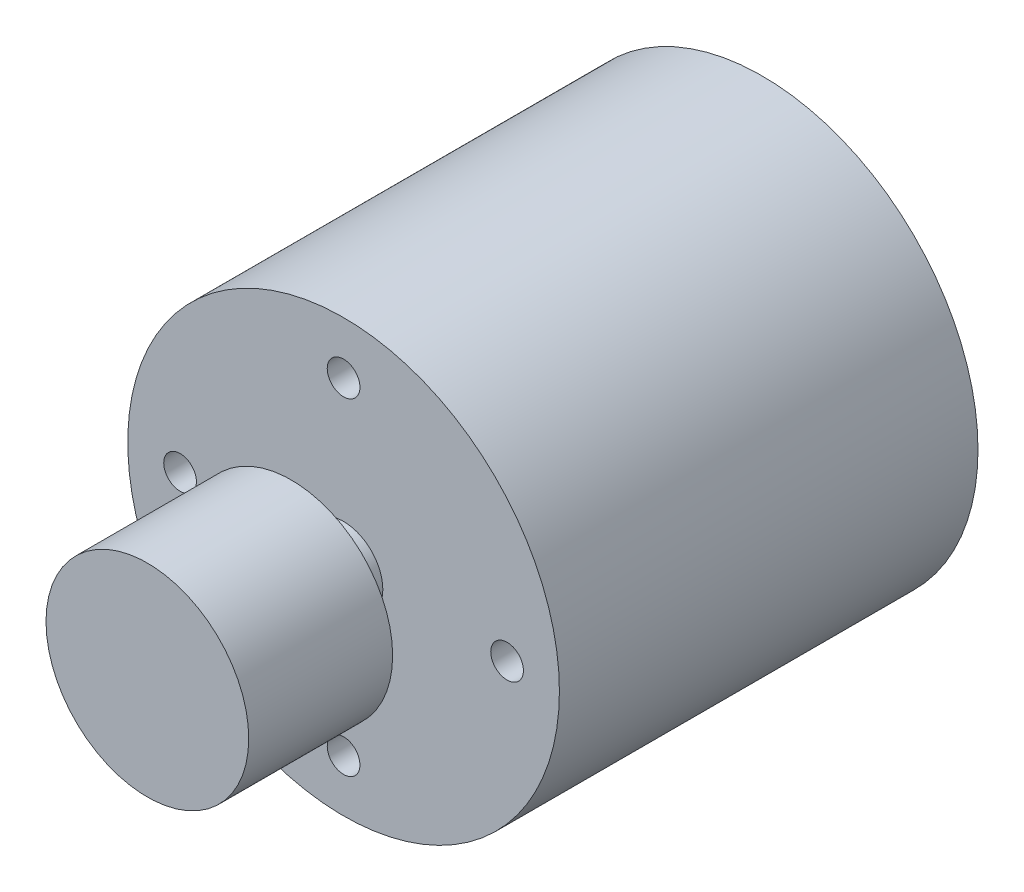
ISO-10303-21;
HEADER;
FILE_DESCRIPTION(('STEP AP214'),'2;1');
FILE_NAME('part.step','',(''),(''),'','','');
FILE_SCHEMA(('AUTOMOTIVE_DESIGN { 1 0 10303 214 1 1 1 1 }'));
ENDSEC;
DATA;
#1=APPLICATION_CONTEXT('core data for automotive mechanical design processes');
#2=APPLICATION_PROTOCOL_DEFINITION('international standard','automotive_design',2000,#1);
#3=PRODUCT_CONTEXT('',#1,'mechanical');
#4=PRODUCT('Part','Part','',(#3));
#5=PRODUCT_RELATED_PRODUCT_CATEGORY('part','',(#4));
#6=PRODUCT_DEFINITION_FORMATION('','',#4);
#7=PRODUCT_DEFINITION_CONTEXT('part definition',#1,'design');
#8=PRODUCT_DEFINITION('design','',#6,#7);
#9=PRODUCT_DEFINITION_SHAPE('','',#8);
#10=(LENGTH_UNIT() NAMED_UNIT(*) SI_UNIT(.MILLI.,.METRE.));
#11=(NAMED_UNIT(*) PLANE_ANGLE_UNIT() SI_UNIT($,.RADIAN.));
#12=(NAMED_UNIT(*) SI_UNIT($,.STERADIAN.) SOLID_ANGLE_UNIT());
#13=UNCERTAINTY_MEASURE_WITH_UNIT(LENGTH_MEASURE(1.E-05),#10,'distance_accuracy_value','');
#14=(GEOMETRIC_REPRESENTATION_CONTEXT(3) GLOBAL_UNCERTAINTY_ASSIGNED_CONTEXT((#13)) GLOBAL_UNIT_ASSIGNED_CONTEXT((#10,
#11,#12)) REPRESENTATION_CONTEXT('',''));
#15=CARTESIAN_POINT('',(0.,0.,0.));
#16=DIRECTION('',(0.,0.,1.));
#17=DIRECTION('',(1.,0.,0.));
#18=AXIS2_PLACEMENT_3D('',#15,#16,#17);
#19=CARTESIAN_POINT('',(0.,0.,15.));
#20=DIRECTION('',(0.,0.,-1.));
#21=DIRECTION('',(1.,0.,0.));
#22=AXIS2_PLACEMENT_3D('',#19,#20,#21);
#23=CYLINDRICAL_SURFACE('',#22,3.);
#24=CARTESIAN_POINT('',(0.,0.,0.));
#25=DIRECTION('',(0.,0.,1.));
#26=DIRECTION('',(1.,0.,0.));
#27=AXIS2_PLACEMENT_3D('',#24,#25,#26);
#28=CIRCLE('',#27,3.);
#29=CARTESIAN_POINT('',(3.,0.,0.));
#30=VERTEX_POINT('',#29);
#31=EDGE_CURVE('E45',#30,#30,#28,.F.);
#32=ORIENTED_EDGE('',*,*,#31,.F.);
#33=EDGE_LOOP('',(#32));
#34=FACE_BOUND('',#33,.T.);
#35=CARTESIAN_POINT('',(0.,0.,4.00000000000006));
#36=DIRECTION('',(0.,0.,-1.));
#37=DIRECTION('',(-1.,0.,0.));
#38=AXIS2_PLACEMENT_3D('',#35,#36,#37);
#39=CIRCLE('',#38,3.);
#40=CARTESIAN_POINT('',(-2.99999999999999,0.,4.00000000000006));
#41=VERTEX_POINT('',#40);
#42=EDGE_CURVE('E11',#41,#41,#39,.T.);
#43=ORIENTED_EDGE('',*,*,#42,.T.);
#44=EDGE_LOOP('',(#43));
#45=FACE_BOUND('',#44,.T.);
#46=ADVANCED_FACE('F37',(#34,#45),#23,.T.);
#47=CARTESIAN_POINT('',(0.,0.,0.));
#48=DIRECTION('',(0.,0.,-1.));
#49=DIRECTION('',(1.,0.,0.));
#50=AXIS2_PLACEMENT_3D('',#47,#48,#49);
#51=PLANE('',#50);
#52=CARTESIAN_POINT('',(0.,12.5,0.));
#53=DIRECTION('',(0.,0.,-1.));
#54=DIRECTION('',(-1.,0.,0.));
#55=AXIS2_PLACEMENT_3D('',#52,#53,#54);
#56=CIRCLE('',#55,1.24999999999999);
#57=CARTESIAN_POINT('',(-1.24999999999998,12.5,0.));
#58=VERTEX_POINT('',#57);
#59=EDGE_CURVE('E69',#58,#58,#56,.T.);
#60=ORIENTED_EDGE('',*,*,#59,.T.);
#61=EDGE_LOOP('',(#60));
#62=FACE_BOUND('',#61,.T.);
#63=CARTESIAN_POINT('',(-12.5,0.,0.));
#64=DIRECTION('',(0.,0.,-1.));
#65=DIRECTION('',(-1.,0.,0.));
#66=AXIS2_PLACEMENT_3D('',#63,#64,#65);
#67=CIRCLE('',#66,1.24999999999999);
#68=CARTESIAN_POINT('',(-13.75,0.,0.));
#69=VERTEX_POINT('',#68);
#70=EDGE_CURVE('E68',#69,#69,#67,.T.);
#71=ORIENTED_EDGE('',*,*,#70,.T.);
#72=EDGE_LOOP('',(#71));
#73=FACE_BOUND('',#72,.T.);
#74=CARTESIAN_POINT('',(0.,-12.5,0.));
#75=DIRECTION('',(0.,0.,-1.));
#76=DIRECTION('',(-1.,0.,0.));
#77=AXIS2_PLACEMENT_3D('',#74,#75,#76);
#78=CIRCLE('',#77,1.24999999999999);
#79=CARTESIAN_POINT('',(-1.24999999999998,-12.5,0.));
#80=VERTEX_POINT('',#79);
#81=EDGE_CURVE('E81',#80,#80,#78,.T.);
#82=ORIENTED_EDGE('',*,*,#81,.T.);
#83=EDGE_LOOP('',(#82));
#84=FACE_BOUND('',#83,.T.);
#85=CARTESIAN_POINT('',(12.5,0.,0.));
#86=DIRECTION('',(0.,0.,-1.));
#87=DIRECTION('',(-1.,0.,0.));
#88=AXIS2_PLACEMENT_3D('',#85,#86,#87);
#89=CIRCLE('',#88,1.24999999999999);
#90=CARTESIAN_POINT('',(11.25,0.,0.));
#91=VERTEX_POINT('',#90);
#92=EDGE_CURVE('E87',#91,#91,#89,.T.);
#93=ORIENTED_EDGE('',*,*,#92,.T.);
#94=EDGE_LOOP('',(#93));
#95=FACE_BOUND('',#94,.T.);
#96=CARTESIAN_POINT('',(0.,0.,0.));
#97=DIRECTION('',(0.,0.,1.));
#98=DIRECTION('',(1.,0.,0.));
#99=AXIS2_PLACEMENT_3D('',#96,#97,#98);
#100=CIRCLE('',#99,16.5);
#101=CARTESIAN_POINT('',(16.5,0.,0.));
#102=VERTEX_POINT('',#101);
#103=EDGE_CURVE('E93',#102,#102,#100,.T.);
#104=ORIENTED_EDGE('',*,*,#103,.T.);
#105=EDGE_LOOP('',(#104));
#106=FACE_BOUND('',#105,.T.);
#107=ORIENTED_EDGE('',*,*,#31,.T.);
#108=EDGE_LOOP('',(#107));
#109=FACE_BOUND('',#108,.T.);
#110=ADVANCED_FACE('F101',(#62,#73,#84,#95,#106,#109),#51,.F.);
#111=CARTESIAN_POINT('',(0.,0.,-32.));
#112=DIRECTION('',(0.,0.,1.));
#113=DIRECTION('',(-1.,0.,0.));
#114=AXIS2_PLACEMENT_3D('',#111,#112,#113);
#115=CYLINDRICAL_SURFACE('',#114,16.5);
#116=CARTESIAN_POINT('',(0.,0.,-32.));
#117=DIRECTION('',(0.,0.,1.));
#118=DIRECTION('',(1.,0.,0.));
#119=AXIS2_PLACEMENT_3D('',#116,#117,#118);
#120=CIRCLE('',#119,16.5);
#121=CARTESIAN_POINT('',(16.5,0.,-32.));
#122=VERTEX_POINT('',#121);
#123=EDGE_CURVE('E94',#122,#122,#120,.T.);
#124=ORIENTED_EDGE('',*,*,#123,.T.);
#125=EDGE_LOOP('',(#124));
#126=FACE_BOUND('',#125,.T.);
#127=ORIENTED_EDGE('',*,*,#103,.F.);
#128=EDGE_LOOP('',(#127));
#129=FACE_BOUND('',#128,.T.);
#130=ADVANCED_FACE('F39',(#126,#129),#115,.T.);
#131=CARTESIAN_POINT('',(0.,0.,-32.));
#132=DIRECTION('',(0.,0.,-1.));
#133=DIRECTION('',(1.,0.,0.));
#134=AXIS2_PLACEMENT_3D('',#131,#132,#133);
#135=PLANE('',#134);
#136=ORIENTED_EDGE('',*,*,#123,.F.);
#137=EDGE_LOOP('',(#136));
#138=FACE_BOUND('',#137,.T.);
#139=ADVANCED_FACE('F144',(#138),#135,.T.);
#140=CARTESIAN_POINT('',(12.5,0.,-4.));
#141=DIRECTION('',(0.,0.,1.));
#142=DIRECTION('',(-1.,0.,0.));
#143=AXIS2_PLACEMENT_3D('',#140,#141,#142);
#144=CONICAL_SURFACE('',#143,1.25,1.02974425867665);
#145=CARTESIAN_POINT('',(12.5,0.,-4.75107577378445));
#146=VERTEX_POINT('',#145);
#147=VERTEX_LOOP('',#146);
#148=FACE_BOUND('',#147,.T.);
#149=CARTESIAN_POINT('',(12.5,0.,-4.));
#150=DIRECTION('',(0.,0.,-1.));
#151=DIRECTION('',(-1.,0.,0.));
#152=AXIS2_PLACEMENT_3D('',#149,#150,#151);
#153=CIRCLE('',#152,1.25);
#154=CARTESIAN_POINT('',(11.25,0.,-4.));
#155=VERTEX_POINT('',#154);
#156=EDGE_CURVE('E90',#155,#155,#153,.T.);
#157=ORIENTED_EDGE('',*,*,#156,.F.);
#158=EDGE_LOOP('',(#157));
#159=FACE_BOUND('',#158,.T.);
#160=ADVANCED_FACE('F140',(#148,#159),#144,.F.);
#161=CARTESIAN_POINT('',(12.5,0.,0.));
#162=DIRECTION('',(0.,0.,1.));
#163=DIRECTION('',(-1.,0.,0.));
#164=AXIS2_PLACEMENT_3D('',#161,#162,#163);
#165=CYLINDRICAL_SURFACE('',#164,1.24999999999999);
#166=ORIENTED_EDGE('',*,*,#156,.T.);
#167=EDGE_LOOP('',(#166));
#168=FACE_BOUND('',#167,.T.);
#169=ORIENTED_EDGE('',*,*,#92,.F.);
#170=EDGE_LOOP('',(#169));
#171=FACE_BOUND('',#170,.T.);
#172=ADVANCED_FACE('F137',(#168,#171),#165,.F.);
#173=CARTESIAN_POINT('',(0.,-12.5,-4.));
#174=DIRECTION('',(0.,0.,1.));
#175=DIRECTION('',(-1.,0.,0.));
#176=AXIS2_PLACEMENT_3D('',#173,#174,#175);
#177=CONICAL_SURFACE('',#176,1.25,1.02974425867665);
#178=CARTESIAN_POINT('',(0.,-12.5,-4.75107577378442));
#179=VERTEX_POINT('',#178);
#180=VERTEX_LOOP('',#179);
#181=FACE_BOUND('',#180,.T.);
#182=CARTESIAN_POINT('',(0.,-12.5,-4.));
#183=DIRECTION('',(0.,0.,-1.));
#184=DIRECTION('',(-1.,0.,0.));
#185=AXIS2_PLACEMENT_3D('',#182,#183,#184);
#186=CIRCLE('',#185,1.25);
#187=CARTESIAN_POINT('',(-1.24999999999997,-12.5,-4.));
#188=VERTEX_POINT('',#187);
#189=EDGE_CURVE('E84',#188,#188,#186,.T.);
#190=ORIENTED_EDGE('',*,*,#189,.F.);
#191=EDGE_LOOP('',(#190));
#192=FACE_BOUND('',#191,.T.);
#193=ADVANCED_FACE('F133',(#181,#192),#177,.F.);
#194=CARTESIAN_POINT('',(0.,-12.5,0.));
#195=DIRECTION('',(0.,0.,1.));
#196=DIRECTION('',(-1.,0.,0.));
#197=AXIS2_PLACEMENT_3D('',#194,#195,#196);
#198=CYLINDRICAL_SURFACE('',#197,1.24999999999999);
#199=ORIENTED_EDGE('',*,*,#189,.T.);
#200=EDGE_LOOP('',(#199));
#201=FACE_BOUND('',#200,.T.);
#202=ORIENTED_EDGE('',*,*,#81,.F.);
#203=EDGE_LOOP('',(#202));
#204=FACE_BOUND('',#203,.T.);
#205=ADVANCED_FACE('F129',(#201,#204),#198,.F.);
#206=CARTESIAN_POINT('',(-12.5,0.,-3.99999999999995));
#207=DIRECTION('',(0.,0.,1.));
#208=DIRECTION('',(-1.,0.,0.));
#209=AXIS2_PLACEMENT_3D('',#206,#207,#208);
#210=CONICAL_SURFACE('',#209,1.25,1.02974425867665);
#211=CARTESIAN_POINT('',(-12.5,0.,-4.75107577378445));
#212=VERTEX_POINT('',#211);
#213=VERTEX_LOOP('',#212);
#214=FACE_BOUND('',#213,.T.);
#215=CARTESIAN_POINT('',(-12.5,0.,-3.99999999999995));
#216=DIRECTION('',(0.,0.,-1.));
#217=DIRECTION('',(-1.,0.,0.));
#218=AXIS2_PLACEMENT_3D('',#215,#216,#217);
#219=CIRCLE('',#218,1.25);
#220=CARTESIAN_POINT('',(-13.75,0.,-3.99999999999995));
#221=VERTEX_POINT('',#220);
#222=EDGE_CURVE('E72',#221,#221,#219,.T.);
#223=ORIENTED_EDGE('',*,*,#222,.F.);
#224=EDGE_LOOP('',(#223));
#225=FACE_BOUND('',#224,.T.);
#226=ADVANCED_FACE('F125',(#214,#225),#210,.F.);
#227=CARTESIAN_POINT('',(-12.5,0.,0.));
#228=DIRECTION('',(0.,0.,1.));
#229=DIRECTION('',(-1.,0.,0.));
#230=AXIS2_PLACEMENT_3D('',#227,#228,#229);
#231=CYLINDRICAL_SURFACE('',#230,1.24999999999999);
#232=ORIENTED_EDGE('',*,*,#222,.T.);
#233=EDGE_LOOP('',(#232));
#234=FACE_BOUND('',#233,.T.);
#235=ORIENTED_EDGE('',*,*,#70,.F.);
#236=EDGE_LOOP('',(#235));
#237=FACE_BOUND('',#236,.T.);
#238=ADVANCED_FACE('F62',(#234,#237),#231,.F.);
#239=CARTESIAN_POINT('',(0.,12.5,-4.));
#240=DIRECTION('',(0.,0.,1.));
#241=DIRECTION('',(-1.,0.,0.));
#242=AXIS2_PLACEMENT_3D('',#239,#240,#241);
#243=CONICAL_SURFACE('',#242,1.25,1.02974425867665);
#244=CARTESIAN_POINT('',(0.,12.5,-4.75107577378445));
#245=VERTEX_POINT('',#244);
#246=VERTEX_LOOP('',#245);
#247=FACE_BOUND('',#246,.T.);
#248=CARTESIAN_POINT('',(0.,12.5,-4.));
#249=DIRECTION('',(0.,0.,-1.));
#250=DIRECTION('',(-1.,0.,0.));
#251=AXIS2_PLACEMENT_3D('',#248,#249,#250);
#252=CIRCLE('',#251,1.25);
#253=CARTESIAN_POINT('',(-1.25,12.5,-4.));
#254=VERTEX_POINT('',#253);
#255=EDGE_CURVE('E66',#254,#254,#252,.T.);
#256=ORIENTED_EDGE('',*,*,#255,.F.);
#257=EDGE_LOOP('',(#256));
#258=FACE_BOUND('',#257,.T.);
#259=ADVANCED_FACE('F58',(#247,#258),#243,.F.);
#260=CARTESIAN_POINT('',(0.,12.5,0.));
#261=DIRECTION('',(0.,0.,1.));
#262=DIRECTION('',(-1.,0.,0.));
#263=AXIS2_PLACEMENT_3D('',#260,#261,#262);
#264=CYLINDRICAL_SURFACE('',#263,1.24999999999999);
#265=ORIENTED_EDGE('',*,*,#255,.T.);
#266=EDGE_LOOP('',(#265));
#267=FACE_BOUND('',#266,.T.);
#268=ORIENTED_EDGE('',*,*,#59,.F.);
#269=EDGE_LOOP('',(#268));
#270=FACE_BOUND('',#269,.T.);
#271=ADVANCED_FACE('F61',(#267,#270),#264,.F.);
#272=CARTESIAN_POINT('',(0.,0.,4.00000000000006));
#273=DIRECTION('',(0.,0.,1.));
#274=DIRECTION('',(-1.,0.,0.));
#275=AXIS2_PLACEMENT_3D('',#272,#273,#274);
#276=PLANE('',#275);
#277=CARTESIAN_POINT('',(0.,0.,4.00000000000006));
#278=DIRECTION('',(0.,0.,-1.));
#279=DIRECTION('',(-1.,0.,0.));
#280=AXIS2_PLACEMENT_3D('',#277,#278,#279);
#281=CIRCLE('',#280,7.75);
#282=CARTESIAN_POINT('',(-7.74999999999999,0.,4.00000000000006));
#283=VERTEX_POINT('',#282);
#284=EDGE_CURVE('E75',#283,#283,#281,.T.);
#285=ORIENTED_EDGE('',*,*,#284,.T.);
#286=EDGE_LOOP('',(#285));
#287=FACE_BOUND('',#286,.T.);
#288=ORIENTED_EDGE('',*,*,#42,.F.);
#289=EDGE_LOOP('',(#288));
#290=FACE_BOUND('',#289,.T.);
#291=ADVANCED_FACE('F108',(#287,#290),#276,.F.);
#292=CARTESIAN_POINT('',(0.,0.,4.00000000000006));
#293=DIRECTION('',(0.,0.,1.));
#294=DIRECTION('',(-1.,0.,0.));
#295=AXIS2_PLACEMENT_3D('',#292,#293,#294);
#296=CYLINDRICAL_SURFACE('',#295,7.75);
#297=ORIENTED_EDGE('',*,*,#284,.F.);
#298=EDGE_LOOP('',(#297));
#299=FACE_BOUND('',#298,.T.);
#300=CARTESIAN_POINT('',(0.,0.,15.));
#301=DIRECTION('',(0.,0.,-1.));
#302=DIRECTION('',(-1.,0.,0.));
#303=AXIS2_PLACEMENT_3D('',#300,#301,#302);
#304=CIRCLE('',#303,7.75);
#305=CARTESIAN_POINT('',(-7.74999999999997,0.,15.));
#306=VERTEX_POINT('',#305);
#307=EDGE_CURVE('E270',#306,#306,#304,.T.);
#308=ORIENTED_EDGE('',*,*,#307,.T.);
#309=EDGE_LOOP('',(#308));
#310=FACE_BOUND('',#309,.T.);
#311=ADVANCED_FACE('F110',(#299,#310),#296,.T.);
#312=CARTESIAN_POINT('',(0.,0.,15.));
#313=DIRECTION('',(0.,0.,1.));
#314=DIRECTION('',(-1.,0.,0.));
#315=AXIS2_PLACEMENT_3D('',#312,#313,#314);
#316=PLANE('',#315);
#317=ORIENTED_EDGE('',*,*,#307,.F.);
#318=EDGE_LOOP('',(#317));
#319=FACE_BOUND('',#318,.T.);
#320=ADVANCED_FACE('F117',(#319),#316,.T.);
#321=CLOSED_SHELL('',(#46,#110,#130,#139,#160,#172,#193,#205,#226,#238,#259,#271,#291,#311,#320));
#322=MANIFOLD_SOLID_BREP('B2',#321);
#323=ADVANCED_BREP_SHAPE_REPRESENTATION('',(#18,#322),#14);
#324=SHAPE_DEFINITION_REPRESENTATION(#9,#323);
ENDSEC;
END-ISO-10303-21;
